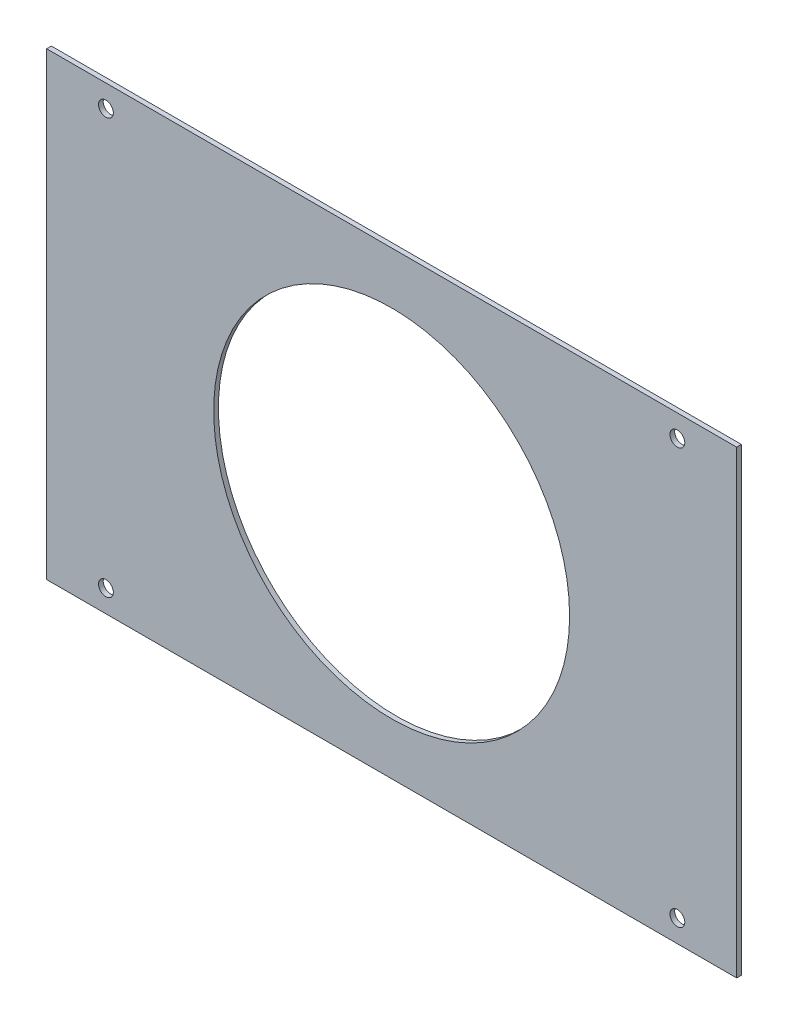
ISO-10303-21;
HEADER;
FILE_DESCRIPTION(('STEP AP214'),'2;1');
FILE_NAME('part.step','',(''),(''),'','','');
FILE_SCHEMA(('AUTOMOTIVE_DESIGN { 1 0 10303 214 1 1 1 1 }'));
ENDSEC;
DATA;
#1=APPLICATION_CONTEXT('core data for automotive mechanical design processes');
#2=APPLICATION_PROTOCOL_DEFINITION('international standard','automotive_design',2000,#1);
#3=PRODUCT_CONTEXT('',#1,'mechanical');
#4=PRODUCT('Part','Part','',(#3));
#5=PRODUCT_RELATED_PRODUCT_CATEGORY('part','',(#4));
#6=PRODUCT_DEFINITION_FORMATION('','',#4);
#7=PRODUCT_DEFINITION_CONTEXT('part definition',#1,'design');
#8=PRODUCT_DEFINITION('design','',#6,#7);
#9=PRODUCT_DEFINITION_SHAPE('','',#8);
#10=(LENGTH_UNIT() NAMED_UNIT(*) SI_UNIT(.MILLI.,.METRE.));
#11=(NAMED_UNIT(*) PLANE_ANGLE_UNIT() SI_UNIT($,.RADIAN.));
#12=(NAMED_UNIT(*) SI_UNIT($,.STERADIAN.) SOLID_ANGLE_UNIT());
#13=UNCERTAINTY_MEASURE_WITH_UNIT(LENGTH_MEASURE(1.E-05),#10,'distance_accuracy_value','');
#14=(GEOMETRIC_REPRESENTATION_CONTEXT(3) GLOBAL_UNCERTAINTY_ASSIGNED_CONTEXT((#13)) GLOBAL_UNIT_ASSIGNED_CONTEXT((#10,
#11,#12)) REPRESENTATION_CONTEXT('',''));
#15=CARTESIAN_POINT('',(0.,0.,0.));
#16=DIRECTION('',(0.,0.,1.));
#17=DIRECTION('',(1.,0.,0.));
#18=AXIS2_PLACEMENT_3D('',#15,#16,#17);
#19=CARTESIAN_POINT('',(-82.7574262073641,17.771163649572,1.5875));
#20=DIRECTION('',(1.,0.,0.));
#21=DIRECTION('',(0.,1.,0.));
#22=AXIS2_PLACEMENT_3D('',#19,#20,#21);
#23=PLANE('',#22);
#24=DIRECTION('',(0.,-1.,0.));
#25=VECTOR('',#24,1.);
#26=CARTESIAN_POINT('',(-82.7574262073641,17.771163649572,0.));
#27=LINE('',#26,#25);
#28=CARTESIAN_POINT('',(-82.7574262073641,17.771163649572,0.));
#29=VERTEX_POINT('',#28);
#30=CARTESIAN_POINT('',(-82.7574262073641,-137.228836350428,0.));
#31=VERTEX_POINT('',#30);
#32=EDGE_CURVE('E105',#29,#31,#27,.T.);
#33=ORIENTED_EDGE('',*,*,#32,.T.);
#34=DIRECTION('',(0.,0.,-1.));
#35=VECTOR('',#34,1.);
#36=CARTESIAN_POINT('',(-82.7574262073641,-137.228836350428,1.5875));
#37=LINE('',#36,#35);
#38=CARTESIAN_POINT('',(-82.7574262073641,-137.228836350428,1.5875));
#39=VERTEX_POINT('',#38);
#40=EDGE_CURVE('E11',#39,#31,#37,.T.);
#41=ORIENTED_EDGE('',*,*,#40,.F.);
#42=DIRECTION('',(0.,-1.,0.));
#43=VECTOR('',#42,1.);
#44=CARTESIAN_POINT('',(-82.7574262073641,17.771163649572,1.5875));
#45=LINE('',#44,#43);
#46=CARTESIAN_POINT('',(-82.7574262073641,17.771163649572,1.5875));
#47=VERTEX_POINT('',#46);
#48=EDGE_CURVE('E82',#47,#39,#45,.T.);
#49=ORIENTED_EDGE('',*,*,#48,.F.);
#50=DIRECTION('',(0.,0.,-1.));
#51=VECTOR('',#50,1.);
#52=CARTESIAN_POINT('',(-82.7574262073641,17.771163649572,1.5875));
#53=LINE('',#52,#51);
#54=EDGE_CURVE('E58',#47,#29,#53,.T.);
#55=ORIENTED_EDGE('',*,*,#54,.T.);
#56=EDGE_LOOP('',(#33,#41,#49,#55));
#57=FACE_BOUND('',#56,.T.);
#58=ADVANCED_FACE('F42',(#57),#23,.F.);
#59=CARTESIAN_POINT('',(149.910225392636,-137.228836350428,1.5875));
#60=DIRECTION('',(0.,-1.,0.));
#61=DIRECTION('',(1.,0.,0.));
#62=AXIS2_PLACEMENT_3D('',#59,#60,#61);
#63=PLANE('',#62);
#64=DIRECTION('',(-1.,0.,0.));
#65=VECTOR('',#64,1.);
#66=CARTESIAN_POINT('',(149.910225392636,-137.228836350428,0.));
#67=LINE('',#66,#65);
#68=CARTESIAN_POINT('',(149.910225392636,-137.228836350428,0.));
#69=VERTEX_POINT('',#68);
#70=EDGE_CURVE('E91',#69,#31,#67,.T.);
#71=ORIENTED_EDGE('',*,*,#70,.F.);
#72=DIRECTION('',(0.,0.,-1.));
#73=VECTOR('',#72,1.);
#74=CARTESIAN_POINT('',(149.910225392636,-137.228836350428,1.5875));
#75=LINE('',#74,#73);
#76=CARTESIAN_POINT('',(149.910225392636,-137.228836350428,1.5875));
#77=VERTEX_POINT('',#76);
#78=EDGE_CURVE('E50',#77,#69,#75,.T.);
#79=ORIENTED_EDGE('',*,*,#78,.F.);
#80=DIRECTION('',(-1.,0.,0.));
#81=VECTOR('',#80,1.);
#82=CARTESIAN_POINT('',(149.910225392636,-137.228836350428,1.5875));
#83=LINE('',#82,#81);
#84=EDGE_CURVE('E89',#77,#39,#83,.T.);
#85=ORIENTED_EDGE('',*,*,#84,.T.);
#86=ORIENTED_EDGE('',*,*,#40,.T.);
#87=EDGE_LOOP('',(#71,#79,#85,#86));
#88=FACE_BOUND('',#87,.T.);
#89=ADVANCED_FACE('F88',(#88),#63,.T.);
#90=CARTESIAN_POINT('',(149.910225392636,17.771163649572,1.5875));
#91=DIRECTION('',(1.,0.,0.));
#92=DIRECTION('',(0.,1.,0.));
#93=AXIS2_PLACEMENT_3D('',#90,#91,#92);
#94=PLANE('',#93);
#95=DIRECTION('',(0.,-1.,0.));
#96=VECTOR('',#95,1.);
#97=CARTESIAN_POINT('',(149.910225392636,17.771163649572,0.));
#98=LINE('',#97,#96);
#99=CARTESIAN_POINT('',(149.910225392636,17.771163649572,0.));
#100=VERTEX_POINT('',#99);
#101=EDGE_CURVE('E109',#100,#69,#98,.T.);
#102=ORIENTED_EDGE('',*,*,#101,.F.);
#103=DIRECTION('',(0.,0.,-1.));
#104=VECTOR('',#103,1.);
#105=CARTESIAN_POINT('',(149.910225392636,17.771163649572,1.5875));
#106=LINE('',#105,#104);
#107=CARTESIAN_POINT('',(149.910225392636,17.771163649572,1.5875));
#108=VERTEX_POINT('',#107);
#109=EDGE_CURVE('E71',#108,#100,#106,.T.);
#110=ORIENTED_EDGE('',*,*,#109,.F.);
#111=DIRECTION('',(0.,-1.,0.));
#112=VECTOR('',#111,1.);
#113=CARTESIAN_POINT('',(149.910225392636,17.771163649572,1.5875));
#114=LINE('',#113,#112);
#115=EDGE_CURVE('E97',#108,#77,#114,.T.);
#116=ORIENTED_EDGE('',*,*,#115,.T.);
#117=ORIENTED_EDGE('',*,*,#78,.T.);
#118=EDGE_LOOP('',(#102,#110,#116,#117));
#119=FACE_BOUND('',#118,.T.);
#120=ADVANCED_FACE('F99',(#119),#94,.T.);
#121=CARTESIAN_POINT('',(-82.7574262073641,17.771163649572,1.5875));
#122=DIRECTION('',(0.,1.,0.));
#123=DIRECTION('',(0.,0.,1.));
#124=AXIS2_PLACEMENT_3D('',#121,#122,#123);
#125=PLANE('',#124);
#126=DIRECTION('',(1.,0.,0.));
#127=VECTOR('',#126,1.);
#128=CARTESIAN_POINT('',(-82.7574262073641,17.771163649572,0.));
#129=LINE('',#128,#127);
#130=EDGE_CURVE('E111',#29,#100,#129,.T.);
#131=ORIENTED_EDGE('',*,*,#130,.F.);
#132=ORIENTED_EDGE('',*,*,#54,.F.);
#133=DIRECTION('',(1.,0.,0.));
#134=VECTOR('',#133,1.);
#135=CARTESIAN_POINT('',(-82.7574262073641,17.771163649572,1.5875));
#136=LINE('',#135,#134);
#137=EDGE_CURVE('E100',#47,#108,#136,.T.);
#138=ORIENTED_EDGE('',*,*,#137,.T.);
#139=ORIENTED_EDGE('',*,*,#109,.T.);
#140=EDGE_LOOP('',(#131,#132,#138,#139));
#141=FACE_BOUND('',#140,.T.);
#142=ADVANCED_FACE('F152',(#141),#125,.T.);
#143=CARTESIAN_POINT('',(0.,0.,1.5875));
#144=DIRECTION('',(0.,0.,-1.));
#145=DIRECTION('',(-1.,0.,0.));
#146=AXIS2_PLACEMENT_3D('',#143,#144,#145);
#147=PLANE('',#146);
#148=CARTESIAN_POINT('',(129.910225392636,-129.728836350428,1.5875));
#149=DIRECTION('',(0.,0.,1.));
#150=DIRECTION('',(1.,0.,0.));
#151=AXIS2_PLACEMENT_3D('',#148,#149,#150);
#152=CIRCLE('',#151,2.5);
#153=CARTESIAN_POINT('',(132.410225392636,-129.728836350428,1.5875));
#154=VERTEX_POINT('',#153);
#155=EDGE_CURVE('E126',#154,#154,#152,.T.);
#156=ORIENTED_EDGE('',*,*,#155,.F.);
#157=EDGE_LOOP('',(#156));
#158=FACE_BOUND('',#157,.T.);
#159=CARTESIAN_POINT('',(-62.7574262073641,10.271163649572,1.5875));
#160=DIRECTION('',(0.,0.,1.));
#161=DIRECTION('',(1.,0.,0.));
#162=AXIS2_PLACEMENT_3D('',#159,#160,#161);
#163=CIRCLE('',#162,2.5);
#164=CARTESIAN_POINT('',(-60.2574262073641,10.271163649572,1.5875));
#165=VERTEX_POINT('',#164);
#166=EDGE_CURVE('E132',#165,#165,#163,.T.);
#167=ORIENTED_EDGE('',*,*,#166,.F.);
#168=EDGE_LOOP('',(#167));
#169=FACE_BOUND('',#168,.T.);
#170=CARTESIAN_POINT('',(-62.7574262073641,-129.728836350428,1.5875));
#171=DIRECTION('',(0.,0.,1.));
#172=DIRECTION('',(1.,0.,0.));
#173=AXIS2_PLACEMENT_3D('',#170,#171,#172);
#174=CIRCLE('',#173,2.5);
#175=CARTESIAN_POINT('',(-60.2574262073641,-129.728836350428,1.5875));
#176=VERTEX_POINT('',#175);
#177=EDGE_CURVE('E133',#176,#176,#174,.T.);
#178=ORIENTED_EDGE('',*,*,#177,.F.);
#179=EDGE_LOOP('',(#178));
#180=FACE_BOUND('',#179,.T.);
#181=CARTESIAN_POINT('',(129.910225392636,10.271163649572,1.5875));
#182=DIRECTION('',(0.,0.,1.));
#183=DIRECTION('',(1.,0.,0.));
#184=AXIS2_PLACEMENT_3D('',#181,#182,#183);
#185=CIRCLE('',#184,2.5);
#186=CARTESIAN_POINT('',(132.410225392636,10.271163649572,1.5875));
#187=VERTEX_POINT('',#186);
#188=EDGE_CURVE('E123',#187,#187,#185,.T.);
#189=ORIENTED_EDGE('',*,*,#188,.F.);
#190=EDGE_LOOP('',(#189));
#191=FACE_BOUND('',#190,.T.);
#192=CARTESIAN_POINT('',(33.5763995926359,-59.728836350428,1.5875));
#193=DIRECTION('',(0.,0.,1.));
#194=DIRECTION('',(1.,0.,0.));
#195=AXIS2_PLACEMENT_3D('',#192,#193,#194);
#196=CIRCLE('',#195,60.);
#197=CARTESIAN_POINT('',(93.5763995926359,-59.728836350428,1.5875));
#198=VERTEX_POINT('',#197);
#199=EDGE_CURVE('E117',#198,#198,#196,.T.);
#200=ORIENTED_EDGE('',*,*,#199,.F.);
#201=EDGE_LOOP('',(#200));
#202=FACE_BOUND('',#201,.T.);
#203=ORIENTED_EDGE('',*,*,#48,.T.);
#204=ORIENTED_EDGE('',*,*,#84,.F.);
#205=ORIENTED_EDGE('',*,*,#115,.F.);
#206=ORIENTED_EDGE('',*,*,#137,.F.);
#207=EDGE_LOOP('',(#203,#204,#205,#206));
#208=FACE_BOUND('',#207,.T.);
#209=ADVANCED_FACE('F96',(#158,#169,#180,#191,#202,#208),#147,.F.);
#210=CARTESIAN_POINT('',(0.,0.,0.));
#211=DIRECTION('',(0.,0.,-1.));
#212=DIRECTION('',(-1.,0.,0.));
#213=AXIS2_PLACEMENT_3D('',#210,#211,#212);
#214=PLANE('',#213);
#215=CARTESIAN_POINT('',(129.910225392636,-129.728836350428,0.));
#216=DIRECTION('',(0.,0.,1.));
#217=DIRECTION('',(1.,0.,0.));
#218=AXIS2_PLACEMENT_3D('',#215,#216,#217);
#219=CIRCLE('',#218,2.5);
#220=CARTESIAN_POINT('',(132.410225392636,-129.728836350428,0.));
#221=VERTEX_POINT('',#220);
#222=EDGE_CURVE('E136',#221,#221,#219,.T.);
#223=ORIENTED_EDGE('',*,*,#222,.T.);
#224=EDGE_LOOP('',(#223));
#225=FACE_BOUND('',#224,.T.);
#226=CARTESIAN_POINT('',(-62.7574262073641,10.271163649572,0.));
#227=DIRECTION('',(0.,0.,1.));
#228=DIRECTION('',(1.,0.,0.));
#229=AXIS2_PLACEMENT_3D('',#226,#227,#228);
#230=CIRCLE('',#229,2.5);
#231=CARTESIAN_POINT('',(-60.2574262073641,10.271163649572,0.));
#232=VERTEX_POINT('',#231);
#233=EDGE_CURVE('E129',#232,#232,#230,.T.);
#234=ORIENTED_EDGE('',*,*,#233,.T.);
#235=EDGE_LOOP('',(#234));
#236=FACE_BOUND('',#235,.T.);
#237=CARTESIAN_POINT('',(-62.7574262073641,-129.728836350428,0.));
#238=DIRECTION('',(0.,0.,1.));
#239=DIRECTION('',(1.,0.,0.));
#240=AXIS2_PLACEMENT_3D('',#237,#238,#239);
#241=CIRCLE('',#240,2.5);
#242=CARTESIAN_POINT('',(-60.2574262073641,-129.728836350428,0.));
#243=VERTEX_POINT('',#242);
#244=EDGE_CURVE('E141',#243,#243,#241,.T.);
#245=ORIENTED_EDGE('',*,*,#244,.T.);
#246=EDGE_LOOP('',(#245));
#247=FACE_BOUND('',#246,.T.);
#248=CARTESIAN_POINT('',(129.910225392636,10.271163649572,0.));
#249=DIRECTION('',(0.,0.,1.));
#250=DIRECTION('',(1.,0.,0.));
#251=AXIS2_PLACEMENT_3D('',#248,#249,#250);
#252=CIRCLE('',#251,2.5);
#253=CARTESIAN_POINT('',(132.410225392636,10.271163649572,0.));
#254=VERTEX_POINT('',#253);
#255=EDGE_CURVE('E120',#254,#254,#252,.T.);
#256=ORIENTED_EDGE('',*,*,#255,.T.);
#257=EDGE_LOOP('',(#256));
#258=FACE_BOUND('',#257,.T.);
#259=CARTESIAN_POINT('',(33.5763995926359,-59.728836350428,0.));
#260=DIRECTION('',(0.,0.,1.));
#261=DIRECTION('',(1.,0.,0.));
#262=AXIS2_PLACEMENT_3D('',#259,#260,#261);
#263=CIRCLE('',#262,60.);
#264=CARTESIAN_POINT('',(93.5763995926359,-59.728836350428,0.));
#265=VERTEX_POINT('',#264);
#266=EDGE_CURVE('E107',#265,#265,#263,.T.);
#267=ORIENTED_EDGE('',*,*,#266,.T.);
#268=EDGE_LOOP('',(#267));
#269=FACE_BOUND('',#268,.T.);
#270=ORIENTED_EDGE('',*,*,#32,.F.);
#271=ORIENTED_EDGE('',*,*,#130,.T.);
#272=ORIENTED_EDGE('',*,*,#101,.T.);
#273=ORIENTED_EDGE('',*,*,#70,.T.);
#274=EDGE_LOOP('',(#270,#271,#272,#273));
#275=FACE_BOUND('',#274,.T.);
#276=ADVANCED_FACE('F151',(#225,#236,#247,#258,#269,#275),#214,.T.);
#277=CARTESIAN_POINT('',(33.5763995926359,-59.728836350428,0.));
#278=DIRECTION('',(0.,0.,1.));
#279=DIRECTION('',(1.,0.,0.));
#280=AXIS2_PLACEMENT_3D('',#277,#278,#279);
#281=CYLINDRICAL_SURFACE('',#280,60.);
#282=ORIENTED_EDGE('',*,*,#266,.F.);
#283=EDGE_LOOP('',(#282));
#284=FACE_BOUND('',#283,.T.);
#285=ORIENTED_EDGE('',*,*,#199,.T.);
#286=EDGE_LOOP('',(#285));
#287=FACE_BOUND('',#286,.T.);
#288=ADVANCED_FACE('F159',(#284,#287),#281,.F.);
#289=CARTESIAN_POINT('',(129.910225392636,10.271163649572,0.));
#290=DIRECTION('',(0.,0.,1.));
#291=DIRECTION('',(1.,0.,0.));
#292=AXIS2_PLACEMENT_3D('',#289,#290,#291);
#293=CYLINDRICAL_SURFACE('',#292,2.5);
#294=ORIENTED_EDGE('',*,*,#255,.F.);
#295=EDGE_LOOP('',(#294));
#296=FACE_BOUND('',#295,.T.);
#297=ORIENTED_EDGE('',*,*,#188,.T.);
#298=EDGE_LOOP('',(#297));
#299=FACE_BOUND('',#298,.T.);
#300=ADVANCED_FACE('F161',(#296,#299),#293,.F.);
#301=CARTESIAN_POINT('',(-62.7574262073641,-129.728836350428,0.));
#302=DIRECTION('',(0.,0.,1.));
#303=DIRECTION('',(1.,0.,0.));
#304=AXIS2_PLACEMENT_3D('',#301,#302,#303);
#305=CYLINDRICAL_SURFACE('',#304,2.5);
#306=ORIENTED_EDGE('',*,*,#244,.F.);
#307=EDGE_LOOP('',(#306));
#308=FACE_BOUND('',#307,.T.);
#309=ORIENTED_EDGE('',*,*,#177,.T.);
#310=EDGE_LOOP('',(#309));
#311=FACE_BOUND('',#310,.T.);
#312=ADVANCED_FACE('F147',(#308,#311),#305,.F.);
#313=CARTESIAN_POINT('',(-62.7574262073641,10.271163649572,0.));
#314=DIRECTION('',(0.,0.,1.));
#315=DIRECTION('',(1.,0.,0.));
#316=AXIS2_PLACEMENT_3D('',#313,#314,#315);
#317=CYLINDRICAL_SURFACE('',#316,2.5);
#318=ORIENTED_EDGE('',*,*,#233,.F.);
#319=EDGE_LOOP('',(#318));
#320=FACE_BOUND('',#319,.T.);
#321=ORIENTED_EDGE('',*,*,#166,.T.);
#322=EDGE_LOOP('',(#321));
#323=FACE_BOUND('',#322,.T.);
#324=ADVANCED_FACE('F238',(#320,#323),#317,.F.);
#325=CARTESIAN_POINT('',(129.910225392636,-129.728836350428,0.));
#326=DIRECTION('',(0.,0.,1.));
#327=DIRECTION('',(1.,0.,0.));
#328=AXIS2_PLACEMENT_3D('',#325,#326,#327);
#329=CYLINDRICAL_SURFACE('',#328,2.5);
#330=ORIENTED_EDGE('',*,*,#222,.F.);
#331=EDGE_LOOP('',(#330));
#332=FACE_BOUND('',#331,.T.);
#333=ORIENTED_EDGE('',*,*,#155,.T.);
#334=EDGE_LOOP('',(#333));
#335=FACE_BOUND('',#334,.T.);
#336=ADVANCED_FACE('F248',(#332,#335),#329,.F.);
#337=CLOSED_SHELL('',(#58,#89,#120,#142,#209,#276,#288,#300,#312,#324,#336));
#338=MANIFOLD_SOLID_BREP('B2',#337);
#339=ADVANCED_BREP_SHAPE_REPRESENTATION('',(#18,#338),#14);
#340=SHAPE_DEFINITION_REPRESENTATION(#9,#339);
ENDSEC;
END-ISO-10303-21;
